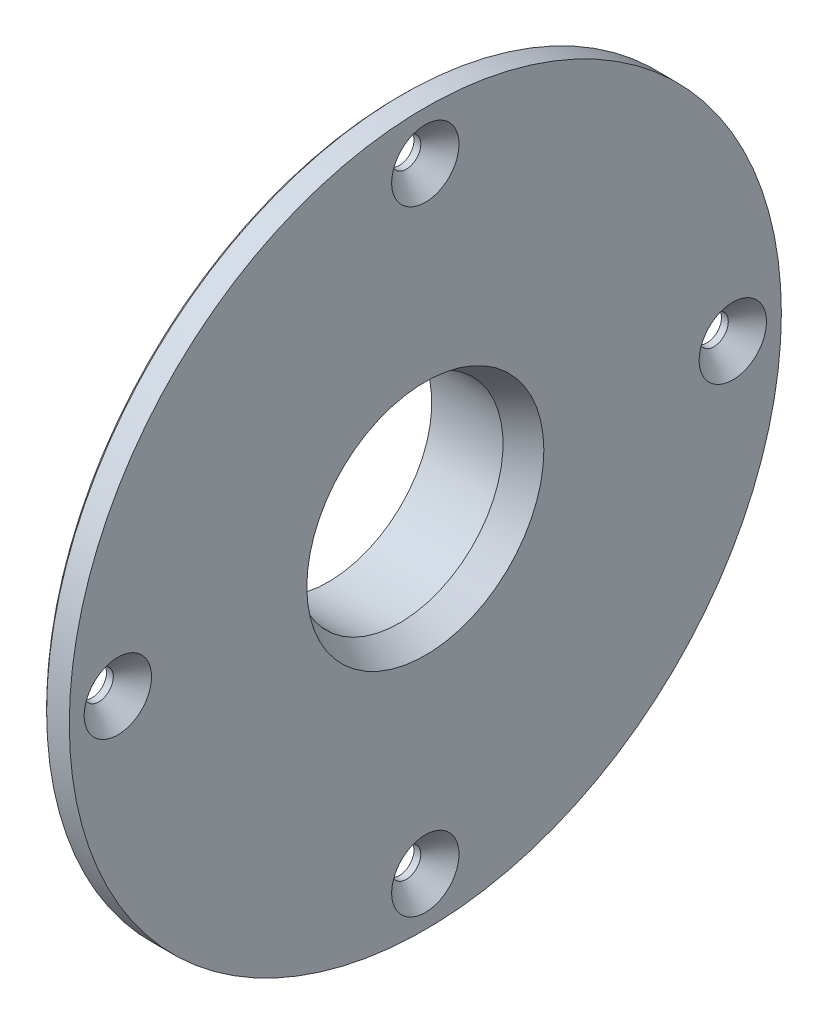
ISO-10303-21;
HEADER;
FILE_DESCRIPTION(('STEP AP214'),'2;1');
FILE_NAME('part.step','',(''),(''),'','','');
FILE_SCHEMA(('AUTOMOTIVE_DESIGN { 1 0 10303 214 1 1 1 1 }'));
ENDSEC;
DATA;
#1=APPLICATION_CONTEXT('core data for automotive mechanical design processes');
#2=APPLICATION_PROTOCOL_DEFINITION('international standard','automotive_design',2000,#1);
#3=PRODUCT_CONTEXT('',#1,'mechanical');
#4=PRODUCT('Part','Part','',(#3));
#5=PRODUCT_RELATED_PRODUCT_CATEGORY('part','',(#4));
#6=PRODUCT_DEFINITION_FORMATION('','',#4);
#7=PRODUCT_DEFINITION_CONTEXT('part definition',#1,'design');
#8=PRODUCT_DEFINITION('design','',#6,#7);
#9=PRODUCT_DEFINITION_SHAPE('','',#8);
#10=(LENGTH_UNIT() NAMED_UNIT(*) SI_UNIT(.MILLI.,.METRE.));
#11=(NAMED_UNIT(*) PLANE_ANGLE_UNIT() SI_UNIT($,.RADIAN.));
#12=(NAMED_UNIT(*) SI_UNIT($,.STERADIAN.) SOLID_ANGLE_UNIT());
#13=UNCERTAINTY_MEASURE_WITH_UNIT(LENGTH_MEASURE(1.E-05),#10,'distance_accuracy_value','');
#14=(GEOMETRIC_REPRESENTATION_CONTEXT(3) GLOBAL_UNCERTAINTY_ASSIGNED_CONTEXT((#13)) GLOBAL_UNIT_ASSIGNED_CONTEXT((#10,
#11,#12)) REPRESENTATION_CONTEXT('',''));
#15=CARTESIAN_POINT('',(0.,0.,0.));
#16=DIRECTION('',(0.,0.,1.));
#17=DIRECTION('',(1.,0.,0.));
#18=AXIS2_PLACEMENT_3D('',#15,#16,#17);
#19=CARTESIAN_POINT('',(0.,0.,0.));
#20=DIRECTION('',(-1.,0.,0.));
#21=DIRECTION('',(0.,0.,1.));
#22=AXIS2_PLACEMENT_3D('',#19,#20,#21);
#23=CYLINDRICAL_SURFACE('',#22,26.5);
#24=CARTESIAN_POINT('',(7.,0.,0.));
#25=DIRECTION('',(-1.,0.,0.));
#26=DIRECTION('',(0.,0.,1.));
#27=AXIS2_PLACEMENT_3D('',#24,#25,#26);
#28=CIRCLE('',#27,26.5);
#29=CARTESIAN_POINT('',(7.,0.,26.5));
#30=VERTEX_POINT('',#29);
#31=EDGE_CURVE('E131',#30,#30,#28,.T.);
#32=ORIENTED_EDGE('',*,*,#31,.F.);
#33=EDGE_LOOP('',(#32));
#34=FACE_BOUND('',#33,.T.);
#35=CARTESIAN_POINT('',(11.,0.,0.));
#36=DIRECTION('',(-1.,0.,0.));
#37=DIRECTION('',(0.,0.,1.));
#38=AXIS2_PLACEMENT_3D('',#35,#36,#37);
#39=CIRCLE('',#38,26.5);
#40=CARTESIAN_POINT('',(11.,0.,26.5));
#41=VERTEX_POINT('',#40);
#42=EDGE_CURVE('E119',#41,#41,#39,.T.);
#43=ORIENTED_EDGE('',*,*,#42,.T.);
#44=EDGE_LOOP('',(#43));
#45=FACE_BOUND('',#44,.T.);
#46=ADVANCED_FACE('F37',(#34,#45),#23,.T.);
#47=CARTESIAN_POINT('',(7.,26.5,0.));
#48=DIRECTION('',(1.,0.,0.));
#49=DIRECTION('',(0.,0.,-1.));
#50=AXIS2_PLACEMENT_3D('',#47,#48,#49);
#51=PLANE('',#50);
#52=CARTESIAN_POINT('',(7.,0.,0.));
#53=DIRECTION('',(-1.,0.,0.));
#54=DIRECTION('',(0.,0.,1.));
#55=AXIS2_PLACEMENT_3D('',#52,#53,#54);
#56=CIRCLE('',#55,25.);
#57=CARTESIAN_POINT('',(7.,0.,25.));
#58=VERTEX_POINT('',#57);
#59=EDGE_CURVE('E128',#58,#58,#56,.T.);
#60=ORIENTED_EDGE('',*,*,#59,.F.);
#61=EDGE_LOOP('',(#60));
#62=FACE_BOUND('',#61,.T.);
#63=ORIENTED_EDGE('',*,*,#31,.T.);
#64=EDGE_LOOP('',(#63));
#65=FACE_BOUND('',#64,.T.);
#66=ADVANCED_FACE('F167',(#62,#65),#51,.F.);
#67=CARTESIAN_POINT('',(0.,0.,0.));
#68=DIRECTION('',(-1.,0.,0.));
#69=DIRECTION('',(0.,0.,1.));
#70=AXIS2_PLACEMENT_3D('',#67,#68,#69);
#71=CYLINDRICAL_SURFACE('',#70,25.);
#72=CARTESIAN_POINT('',(0.499999999999997,0.,0.));
#73=DIRECTION('',(1.,0.,0.));
#74=DIRECTION('',(0.,0.,-1.));
#75=AXIS2_PLACEMENT_3D('',#72,#73,#74);
#76=CIRCLE('',#75,25.);
#77=CARTESIAN_POINT('',(0.499999999999997,0.,-25.));
#78=VERTEX_POINT('',#77);
#79=EDGE_CURVE('E151',#78,#78,#76,.T.);
#80=ORIENTED_EDGE('',*,*,#79,.T.);
#81=EDGE_LOOP('',(#80));
#82=FACE_BOUND('',#81,.T.);
#83=ORIENTED_EDGE('',*,*,#59,.T.);
#84=EDGE_LOOP('',(#83));
#85=FACE_BOUND('',#84,.T.);
#86=ADVANCED_FACE('F173',(#82,#85),#71,.T.);
#87=CARTESIAN_POINT('',(0.,16.,0.));
#88=DIRECTION('',(1.,0.,0.));
#89=DIRECTION('',(0.,0.,-1.));
#90=AXIS2_PLACEMENT_3D('',#87,#88,#89);
#91=PLANE('',#90);
#92=CARTESIAN_POINT('',(0.,22.5,0.));
#93=DIRECTION('',(-1.,0.,0.));
#94=DIRECTION('',(0.,0.,1.));
#95=AXIS2_PLACEMENT_3D('',#92,#93,#94);
#96=CIRCLE('',#95,1.24999999999999);
#97=CARTESIAN_POINT('',(0.,22.5,1.24999999999999));
#98=VERTEX_POINT('',#97);
#99=EDGE_CURVE('E69',#98,#98,#96,.T.);
#100=ORIENTED_EDGE('',*,*,#99,.F.);
#101=EDGE_LOOP('',(#100));
#102=FACE_BOUND('',#101,.T.);
#103=CARTESIAN_POINT('',(0.,0.,-22.5));
#104=DIRECTION('',(-1.,0.,0.));
#105=DIRECTION('',(0.,0.,1.));
#106=AXIS2_PLACEMENT_3D('',#103,#104,#105);
#107=CIRCLE('',#106,1.24999999999999);
#108=CARTESIAN_POINT('',(0.,0.,-21.25));
#109=VERTEX_POINT('',#108);
#110=EDGE_CURVE('E68',#109,#109,#107,.T.);
#111=ORIENTED_EDGE('',*,*,#110,.F.);
#112=EDGE_LOOP('',(#111));
#113=FACE_BOUND('',#112,.T.);
#114=CARTESIAN_POINT('',(0.,-22.5,0.));
#115=DIRECTION('',(-1.,0.,0.));
#116=DIRECTION('',(0.,0.,1.));
#117=AXIS2_PLACEMENT_3D('',#114,#115,#116);
#118=CIRCLE('',#117,1.24999999999999);
#119=CARTESIAN_POINT('',(0.,-22.5,1.24999999999999));
#120=VERTEX_POINT('',#119);
#121=EDGE_CURVE('E79',#120,#120,#118,.T.);
#122=ORIENTED_EDGE('',*,*,#121,.F.);
#123=EDGE_LOOP('',(#122));
#124=FACE_BOUND('',#123,.T.);
#125=CARTESIAN_POINT('',(0.,0.,22.5));
#126=DIRECTION('',(-1.,0.,0.));
#127=DIRECTION('',(0.,0.,1.));
#128=AXIS2_PLACEMENT_3D('',#125,#126,#127);
#129=CIRCLE('',#128,1.24999999999999);
#130=CARTESIAN_POINT('',(0.,0.,23.75));
#131=VERTEX_POINT('',#130);
#132=EDGE_CURVE('E85',#131,#131,#129,.T.);
#133=ORIENTED_EDGE('',*,*,#132,.F.);
#134=EDGE_LOOP('',(#133));
#135=FACE_BOUND('',#134,.T.);
#136=CARTESIAN_POINT('',(0.,0.,0.));
#137=DIRECTION('',(1.,0.,0.));
#138=DIRECTION('',(0.,0.,-1.));
#139=AXIS2_PLACEMENT_3D('',#136,#137,#138);
#140=CIRCLE('',#139,24.5);
#141=CARTESIAN_POINT('',(0.,0.,-24.5));
#142=VERTEX_POINT('',#141);
#143=EDGE_CURVE('E148',#142,#142,#140,.F.);
#144=ORIENTED_EDGE('',*,*,#143,.T.);
#145=EDGE_LOOP('',(#144));
#146=FACE_BOUND('',#145,.T.);
#147=CARTESIAN_POINT('',(0.,0.,0.));
#148=DIRECTION('',(-1.,0.,0.));
#149=DIRECTION('',(0.,0.,1.));
#150=AXIS2_PLACEMENT_3D('',#147,#148,#149);
#151=CIRCLE('',#150,16.);
#152=CARTESIAN_POINT('',(0.,0.,16.));
#153=VERTEX_POINT('',#152);
#154=EDGE_CURVE('E125',#153,#153,#151,.T.);
#155=ORIENTED_EDGE('',*,*,#154,.F.);
#156=EDGE_LOOP('',(#155));
#157=FACE_BOUND('',#156,.T.);
#158=ADVANCED_FACE('F197',(#102,#113,#124,#135,#146,#157),#91,.F.);
#159=CARTESIAN_POINT('',(0.,0.,0.));
#160=DIRECTION('',(-1.,0.,0.));
#161=DIRECTION('',(0.,0.,1.));
#162=AXIS2_PLACEMENT_3D('',#159,#160,#161);
#163=CYLINDRICAL_SURFACE('',#162,16.);
#164=CARTESIAN_POINT('',(11.,0.,0.));
#165=DIRECTION('',(-1.,0.,0.));
#166=DIRECTION('',(0.,0.,1.));
#167=AXIS2_PLACEMENT_3D('',#164,#165,#166);
#168=CIRCLE('',#167,16.);
#169=CARTESIAN_POINT('',(11.,0.,16.));
#170=VERTEX_POINT('',#169);
#171=EDGE_CURVE('E11',#170,#170,#168,.F.);
#172=ORIENTED_EDGE('',*,*,#171,.T.);
#173=EDGE_LOOP('',(#172));
#174=FACE_BOUND('',#173,.T.);
#175=ORIENTED_EDGE('',*,*,#154,.T.);
#176=EDGE_LOOP('',(#175));
#177=FACE_BOUND('',#176,.T.);
#178=ADVANCED_FACE('F200',(#174,#177),#163,.F.);
#179=CARTESIAN_POINT('',(15.,55.,0.));
#180=DIRECTION('',(-1.,0.,0.));
#181=DIRECTION('',(0.,0.,1.));
#182=AXIS2_PLACEMENT_3D('',#179,#180,#181);
#183=PLANE('',#182);
#184=CARTESIAN_POINT('',(15.,0.,0.));
#185=DIRECTION('',(-1.,0.,0.));
#186=DIRECTION('',(0.,0.,1.));
#187=AXIS2_PLACEMENT_3D('',#184,#185,#186);
#188=CIRCLE('',#187,18.3094010767585);
#189=CARTESIAN_POINT('',(15.,0.,18.3094010767585));
#190=VERTEX_POINT('',#189);
#191=EDGE_CURVE('E45',#190,#190,#188,.T.);
#192=ORIENTED_EDGE('',*,*,#191,.T.);
#193=EDGE_LOOP('',(#192));
#194=FACE_BOUND('',#193,.T.);
#195=CARTESIAN_POINT('',(15.,47.5,0.));
#196=DIRECTION('',(1.,0.,0.));
#197=DIRECTION('',(0.,0.,-1.));
#198=AXIS2_PLACEMENT_3D('',#195,#196,#197);
#199=CIRCLE('',#198,5.2);
#200=CARTESIAN_POINT('',(15.,47.5,-5.20000000000001));
#201=VERTEX_POINT('',#200);
#202=EDGE_CURVE('E91',#201,#201,#199,.T.);
#203=ORIENTED_EDGE('',*,*,#202,.F.);
#204=EDGE_LOOP('',(#203));
#205=FACE_BOUND('',#204,.T.);
#206=CARTESIAN_POINT('',(15.,0.,-47.5));
#207=DIRECTION('',(1.,0.,0.));
#208=DIRECTION('',(0.,0.,-1.));
#209=AXIS2_PLACEMENT_3D('',#206,#207,#208);
#210=CIRCLE('',#209,5.2);
#211=CARTESIAN_POINT('',(15.,0.,-52.7));
#212=VERTEX_POINT('',#211);
#213=EDGE_CURVE('E98',#212,#212,#210,.T.);
#214=ORIENTED_EDGE('',*,*,#213,.F.);
#215=EDGE_LOOP('',(#214));
#216=FACE_BOUND('',#215,.T.);
#217=CARTESIAN_POINT('',(15.,-47.5,0.));
#218=DIRECTION('',(1.,0.,0.));
#219=DIRECTION('',(0.,0.,-1.));
#220=AXIS2_PLACEMENT_3D('',#217,#218,#219);
#221=CIRCLE('',#220,5.2);
#222=CARTESIAN_POINT('',(15.,-47.5,-5.20000000000001));
#223=VERTEX_POINT('',#222);
#224=EDGE_CURVE('E105',#223,#223,#221,.T.);
#225=ORIENTED_EDGE('',*,*,#224,.F.);
#226=EDGE_LOOP('',(#225));
#227=FACE_BOUND('',#226,.T.);
#228=CARTESIAN_POINT('',(15.,0.,47.5));
#229=DIRECTION('',(1.,0.,0.));
#230=DIRECTION('',(0.,0.,-1.));
#231=AXIS2_PLACEMENT_3D('',#228,#229,#230);
#232=CIRCLE('',#231,5.2);
#233=CARTESIAN_POINT('',(15.,0.,42.3));
#234=VERTEX_POINT('',#233);
#235=EDGE_CURVE('E112',#234,#234,#232,.T.);
#236=ORIENTED_EDGE('',*,*,#235,.F.);
#237=EDGE_LOOP('',(#236));
#238=FACE_BOUND('',#237,.T.);
#239=CARTESIAN_POINT('',(15.,0.,0.));
#240=DIRECTION('',(-1.,0.,0.));
#241=DIRECTION('',(0.,0.,1.));
#242=AXIS2_PLACEMENT_3D('',#239,#240,#241);
#243=CIRCLE('',#242,55.);
#244=CARTESIAN_POINT('',(15.,0.,55.));
#245=VERTEX_POINT('',#244);
#246=EDGE_CURVE('E122',#245,#245,#243,.T.);
#247=ORIENTED_EDGE('',*,*,#246,.F.);
#248=EDGE_LOOP('',(#247));
#249=FACE_BOUND('',#248,.T.);
#250=ADVANCED_FACE('F156',(#194,#205,#216,#227,#238,#249),#183,.F.);
#251=CARTESIAN_POINT('',(0.,0.,0.));
#252=DIRECTION('',(-1.,0.,0.));
#253=DIRECTION('',(0.,0.,1.));
#254=AXIS2_PLACEMENT_3D('',#251,#252,#253);
#255=CYLINDRICAL_SURFACE('',#254,55.);
#256=CARTESIAN_POINT('',(11.5,0.,0.));
#257=DIRECTION('',(1.,0.,0.));
#258=DIRECTION('',(0.,0.,-1.));
#259=AXIS2_PLACEMENT_3D('',#256,#257,#258);
#260=CIRCLE('',#259,55.);
#261=CARTESIAN_POINT('',(11.5,0.,-55.));
#262=VERTEX_POINT('',#261);
#263=EDGE_CURVE('E145',#262,#262,#260,.T.);
#264=ORIENTED_EDGE('',*,*,#263,.T.);
#265=EDGE_LOOP('',(#264));
#266=FACE_BOUND('',#265,.T.);
#267=ORIENTED_EDGE('',*,*,#246,.T.);
#268=EDGE_LOOP('',(#267));
#269=FACE_BOUND('',#268,.T.);
#270=ADVANCED_FACE('F211',(#266,#269),#255,.T.);
#271=CARTESIAN_POINT('',(11.,26.5,0.));
#272=DIRECTION('',(1.,0.,0.));
#273=DIRECTION('',(0.,0.,-1.));
#274=AXIS2_PLACEMENT_3D('',#271,#272,#273);
#275=PLANE('',#274);
#276=CARTESIAN_POINT('',(11.,0.,0.));
#277=DIRECTION('',(1.,0.,0.));
#278=DIRECTION('',(0.,0.,-1.));
#279=AXIS2_PLACEMENT_3D('',#276,#277,#278);
#280=CIRCLE('',#279,54.5);
#281=CARTESIAN_POINT('',(11.,0.,-54.5));
#282=VERTEX_POINT('',#281);
#283=EDGE_CURVE('E134',#282,#282,#280,.F.);
#284=ORIENTED_EDGE('',*,*,#283,.T.);
#285=EDGE_LOOP('',(#284));
#286=FACE_BOUND('',#285,.T.);
#287=CARTESIAN_POINT('',(11.,47.5,0.));
#288=DIRECTION('',(1.,0.,0.));
#289=DIRECTION('',(0.,0.,-1.));
#290=AXIS2_PLACEMENT_3D('',#287,#288,#289);
#291=CIRCLE('',#290,2.24999999999999);
#292=CARTESIAN_POINT('',(11.,47.5,-2.25));
#293=VERTEX_POINT('',#292);
#294=EDGE_CURVE('E97',#293,#293,#291,.T.);
#295=ORIENTED_EDGE('',*,*,#294,.T.);
#296=EDGE_LOOP('',(#295));
#297=FACE_BOUND('',#296,.T.);
#298=CARTESIAN_POINT('',(11.,0.,-47.5));
#299=DIRECTION('',(1.,0.,0.));
#300=DIRECTION('',(0.,0.,-1.));
#301=AXIS2_PLACEMENT_3D('',#298,#299,#300);
#302=CIRCLE('',#301,2.24999999999999);
#303=CARTESIAN_POINT('',(11.,0.,-49.75));
#304=VERTEX_POINT('',#303);
#305=EDGE_CURVE('E104',#304,#304,#302,.T.);
#306=ORIENTED_EDGE('',*,*,#305,.T.);
#307=EDGE_LOOP('',(#306));
#308=FACE_BOUND('',#307,.T.);
#309=CARTESIAN_POINT('',(11.,-47.5,0.));
#310=DIRECTION('',(1.,0.,0.));
#311=DIRECTION('',(0.,0.,-1.));
#312=AXIS2_PLACEMENT_3D('',#309,#310,#311);
#313=CIRCLE('',#312,2.24999999999999);
#314=CARTESIAN_POINT('',(11.,-47.5,-2.25));
#315=VERTEX_POINT('',#314);
#316=EDGE_CURVE('E111',#315,#315,#313,.T.);
#317=ORIENTED_EDGE('',*,*,#316,.T.);
#318=EDGE_LOOP('',(#317));
#319=FACE_BOUND('',#318,.T.);
#320=CARTESIAN_POINT('',(11.,0.,47.5));
#321=DIRECTION('',(1.,0.,0.));
#322=DIRECTION('',(0.,0.,-1.));
#323=AXIS2_PLACEMENT_3D('',#320,#321,#322);
#324=CIRCLE('',#323,2.24999999999999);
#325=CARTESIAN_POINT('',(11.,0.,45.25));
#326=VERTEX_POINT('',#325);
#327=EDGE_CURVE('E118',#326,#326,#324,.T.);
#328=ORIENTED_EDGE('',*,*,#327,.T.);
#329=EDGE_LOOP('',(#328));
#330=FACE_BOUND('',#329,.T.);
#331=ORIENTED_EDGE('',*,*,#42,.F.);
#332=EDGE_LOOP('',(#331));
#333=FACE_BOUND('',#332,.T.);
#334=ADVANCED_FACE('F327',(#286,#297,#308,#319,#330,#333),#275,.F.);
#335=CARTESIAN_POINT('',(15.,0.,47.5));
#336=DIRECTION('',(1.,0.,0.));
#337=DIRECTION('',(0.,0.,-1.));
#338=AXIS2_PLACEMENT_3D('',#335,#336,#337);
#339=CYLINDRICAL_SURFACE('',#338,2.24999999999999);
#340=CARTESIAN_POINT('',(12.05,0.,47.5));
#341=DIRECTION('',(1.,0.,0.));
#342=DIRECTION('',(0.,0.,-1.));
#343=AXIS2_PLACEMENT_3D('',#340,#341,#342);
#344=CIRCLE('',#343,2.24999999999999);
#345=CARTESIAN_POINT('',(12.05,0.,45.25));
#346=VERTEX_POINT('',#345);
#347=EDGE_CURVE('E115',#346,#346,#344,.T.);
#348=ORIENTED_EDGE('',*,*,#347,.T.);
#349=EDGE_LOOP('',(#348));
#350=FACE_BOUND('',#349,.T.);
#351=ORIENTED_EDGE('',*,*,#327,.F.);
#352=EDGE_LOOP('',(#351));
#353=FACE_BOUND('',#352,.T.);
#354=ADVANCED_FACE('F333',(#350,#353),#339,.F.);
#355=CARTESIAN_POINT('',(15.,0.,47.5));
#356=DIRECTION('',(1.,0.,0.));
#357=DIRECTION('',(0.,0.,-1.));
#358=AXIS2_PLACEMENT_3D('',#355,#356,#357);
#359=CONICAL_SURFACE('',#358,5.2,0.785398163397451);
#360=ORIENTED_EDGE('',*,*,#347,.F.);
#361=EDGE_LOOP('',(#360));
#362=FACE_BOUND('',#361,.T.);
#363=ORIENTED_EDGE('',*,*,#235,.T.);
#364=EDGE_LOOP('',(#363));
#365=FACE_BOUND('',#364,.T.);
#366=ADVANCED_FACE('F341',(#362,#365),#359,.F.);
#367=CARTESIAN_POINT('',(15.,-47.5,0.));
#368=DIRECTION('',(1.,0.,0.));
#369=DIRECTION('',(0.,0.,-1.));
#370=AXIS2_PLACEMENT_3D('',#367,#368,#369);
#371=CYLINDRICAL_SURFACE('',#370,2.24999999999999);
#372=CARTESIAN_POINT('',(12.05,-47.5,0.));
#373=DIRECTION('',(1.,0.,0.));
#374=DIRECTION('',(0.,0.,-1.));
#375=AXIS2_PLACEMENT_3D('',#372,#373,#374);
#376=CIRCLE('',#375,2.24999999999999);
#377=CARTESIAN_POINT('',(12.05,-47.5,-2.25));
#378=VERTEX_POINT('',#377);
#379=EDGE_CURVE('E108',#378,#378,#376,.T.);
#380=ORIENTED_EDGE('',*,*,#379,.T.);
#381=EDGE_LOOP('',(#380));
#382=FACE_BOUND('',#381,.T.);
#383=ORIENTED_EDGE('',*,*,#316,.F.);
#384=EDGE_LOOP('',(#383));
#385=FACE_BOUND('',#384,.T.);
#386=ADVANCED_FACE('F349',(#382,#385),#371,.F.);
#387=CARTESIAN_POINT('',(15.,-47.5,0.));
#388=DIRECTION('',(1.,0.,0.));
#389=DIRECTION('',(0.,0.,-1.));
#390=AXIS2_PLACEMENT_3D('',#387,#388,#389);
#391=CONICAL_SURFACE('',#390,5.2,0.78539816339745);
#392=ORIENTED_EDGE('',*,*,#379,.F.);
#393=EDGE_LOOP('',(#392));
#394=FACE_BOUND('',#393,.T.);
#395=ORIENTED_EDGE('',*,*,#224,.T.);
#396=EDGE_LOOP('',(#395));
#397=FACE_BOUND('',#396,.T.);
#398=ADVANCED_FACE('F357',(#394,#397),#391,.F.);
#399=CARTESIAN_POINT('',(15.,0.,-47.5));
#400=DIRECTION('',(1.,0.,0.));
#401=DIRECTION('',(0.,0.,-1.));
#402=AXIS2_PLACEMENT_3D('',#399,#400,#401);
#403=CYLINDRICAL_SURFACE('',#402,2.24999999999999);
#404=CARTESIAN_POINT('',(12.05,0.,-47.5));
#405=DIRECTION('',(1.,0.,0.));
#406=DIRECTION('',(0.,0.,-1.));
#407=AXIS2_PLACEMENT_3D('',#404,#405,#406);
#408=CIRCLE('',#407,2.24999999999999);
#409=CARTESIAN_POINT('',(12.05,0.,-49.75));
#410=VERTEX_POINT('',#409);
#411=EDGE_CURVE('E101',#410,#410,#408,.T.);
#412=ORIENTED_EDGE('',*,*,#411,.T.);
#413=EDGE_LOOP('',(#412));
#414=FACE_BOUND('',#413,.T.);
#415=ORIENTED_EDGE('',*,*,#305,.F.);
#416=EDGE_LOOP('',(#415));
#417=FACE_BOUND('',#416,.T.);
#418=ADVANCED_FACE('F365',(#414,#417),#403,.F.);
#419=CARTESIAN_POINT('',(15.,0.,-47.5));
#420=DIRECTION('',(1.,0.,0.));
#421=DIRECTION('',(0.,0.,-1.));
#422=AXIS2_PLACEMENT_3D('',#419,#420,#421);
#423=CONICAL_SURFACE('',#422,5.2,0.785398163397451);
#424=ORIENTED_EDGE('',*,*,#411,.F.);
#425=EDGE_LOOP('',(#424));
#426=FACE_BOUND('',#425,.T.);
#427=ORIENTED_EDGE('',*,*,#213,.T.);
#428=EDGE_LOOP('',(#427));
#429=FACE_BOUND('',#428,.T.);
#430=ADVANCED_FACE('F373',(#426,#429),#423,.F.);
#431=CARTESIAN_POINT('',(15.,47.5,0.));
#432=DIRECTION('',(1.,0.,0.));
#433=DIRECTION('',(0.,0.,-1.));
#434=AXIS2_PLACEMENT_3D('',#431,#432,#433);
#435=CYLINDRICAL_SURFACE('',#434,2.24999999999999);
#436=CARTESIAN_POINT('',(12.05,47.5,0.));
#437=DIRECTION('',(1.,0.,0.));
#438=DIRECTION('',(0.,0.,-1.));
#439=AXIS2_PLACEMENT_3D('',#436,#437,#438);
#440=CIRCLE('',#439,2.24999999999999);
#441=CARTESIAN_POINT('',(12.05,47.5,-2.25));
#442=VERTEX_POINT('',#441);
#443=EDGE_CURVE('E94',#442,#442,#440,.T.);
#444=ORIENTED_EDGE('',*,*,#443,.T.);
#445=EDGE_LOOP('',(#444));
#446=FACE_BOUND('',#445,.T.);
#447=ORIENTED_EDGE('',*,*,#294,.F.);
#448=EDGE_LOOP('',(#447));
#449=FACE_BOUND('',#448,.T.);
#450=ADVANCED_FACE('F381',(#446,#449),#435,.F.);
#451=CARTESIAN_POINT('',(15.,47.5,0.));
#452=DIRECTION('',(1.,0.,0.));
#453=DIRECTION('',(0.,0.,-1.));
#454=AXIS2_PLACEMENT_3D('',#451,#452,#453);
#455=CONICAL_SURFACE('',#454,5.2,0.78539816339745);
#456=ORIENTED_EDGE('',*,*,#443,.F.);
#457=EDGE_LOOP('',(#456));
#458=FACE_BOUND('',#457,.T.);
#459=ORIENTED_EDGE('',*,*,#202,.T.);
#460=EDGE_LOOP('',(#459));
#461=FACE_BOUND('',#460,.T.);
#462=ADVANCED_FACE('F183',(#458,#461),#455,.F.);
#463=CARTESIAN_POINT('',(11.,0.,0.));
#464=DIRECTION('',(1.,0.,0.));
#465=DIRECTION('',(0.,0.,-1.));
#466=AXIS2_PLACEMENT_3D('',#463,#464,#465);
#467=CONICAL_SURFACE('',#466,54.5,0.785398163397434);
#468=ORIENTED_EDGE('',*,*,#263,.F.);
#469=EDGE_LOOP('',(#468));
#470=FACE_BOUND('',#469,.T.);
#471=ORIENTED_EDGE('',*,*,#283,.F.);
#472=EDGE_LOOP('',(#471));
#473=FACE_BOUND('',#472,.T.);
#474=ADVANCED_FACE('F180',(#470,#473),#467,.T.);
#475=CARTESIAN_POINT('',(0.,0.,0.));
#476=DIRECTION('',(1.,0.,0.));
#477=DIRECTION('',(0.,0.,-1.));
#478=AXIS2_PLACEMENT_3D('',#475,#476,#477);
#479=CONICAL_SURFACE('',#478,24.5,0.785398163397455);
#480=ORIENTED_EDGE('',*,*,#79,.F.);
#481=EDGE_LOOP('',(#480));
#482=FACE_BOUND('',#481,.T.);
#483=ORIENTED_EDGE('',*,*,#143,.F.);
#484=EDGE_LOOP('',(#483));
#485=FACE_BOUND('',#484,.T.);
#486=ADVANCED_FACE('F182',(#482,#485),#479,.T.);
#487=CARTESIAN_POINT('',(10.5,0.,22.5));
#488=DIRECTION('',(-1.,0.,0.));
#489=DIRECTION('',(0.,0.,1.));
#490=AXIS2_PLACEMENT_3D('',#487,#488,#489);
#491=CONICAL_SURFACE('',#490,1.25,1.02974425867665);
#492=CARTESIAN_POINT('',(11.2510757737845,0.,22.5));
#493=VERTEX_POINT('',#492);
#494=VERTEX_LOOP('',#493);
#495=FACE_BOUND('',#494,.T.);
#496=CARTESIAN_POINT('',(10.5,0.,22.5));
#497=DIRECTION('',(-1.,0.,0.));
#498=DIRECTION('',(0.,0.,1.));
#499=AXIS2_PLACEMENT_3D('',#496,#497,#498);
#500=CIRCLE('',#499,1.25);
#501=CARTESIAN_POINT('',(10.5,0.,23.75));
#502=VERTEX_POINT('',#501);
#503=EDGE_CURVE('E88',#502,#502,#500,.T.);
#504=ORIENTED_EDGE('',*,*,#503,.T.);
#505=EDGE_LOOP('',(#504));
#506=FACE_BOUND('',#505,.T.);
#507=ADVANCED_FACE('F186',(#495,#506),#491,.F.);
#508=CARTESIAN_POINT('',(0.,0.,22.5));
#509=DIRECTION('',(-1.,0.,0.));
#510=DIRECTION('',(0.,0.,1.));
#511=AXIS2_PLACEMENT_3D('',#508,#509,#510);
#512=CYLINDRICAL_SURFACE('',#511,1.24999999999999);
#513=ORIENTED_EDGE('',*,*,#503,.F.);
#514=EDGE_LOOP('',(#513));
#515=FACE_BOUND('',#514,.T.);
#516=ORIENTED_EDGE('',*,*,#132,.T.);
#517=EDGE_LOOP('',(#516));
#518=FACE_BOUND('',#517,.T.);
#519=ADVANCED_FACE('F191',(#515,#518),#512,.F.);
#520=CARTESIAN_POINT('',(10.5,-22.5,0.));
#521=DIRECTION('',(-1.,0.,0.));
#522=DIRECTION('',(0.,0.,1.));
#523=AXIS2_PLACEMENT_3D('',#520,#521,#522);
#524=CONICAL_SURFACE('',#523,1.25,1.02974425867665);
#525=CARTESIAN_POINT('',(11.2510757737845,-22.5,0.));
#526=VERTEX_POINT('',#525);
#527=VERTEX_LOOP('',#526);
#528=FACE_BOUND('',#527,.T.);
#529=CARTESIAN_POINT('',(10.5,-22.5,0.));
#530=DIRECTION('',(-1.,0.,0.));
#531=DIRECTION('',(0.,0.,1.));
#532=AXIS2_PLACEMENT_3D('',#529,#530,#531);
#533=CIRCLE('',#532,1.25);
#534=CARTESIAN_POINT('',(10.5,-22.5,1.25));
#535=VERTEX_POINT('',#534);
#536=EDGE_CURVE('E82',#535,#535,#533,.T.);
#537=ORIENTED_EDGE('',*,*,#536,.T.);
#538=EDGE_LOOP('',(#537));
#539=FACE_BOUND('',#538,.T.);
#540=ADVANCED_FACE('F249',(#528,#539),#524,.F.);
#541=CARTESIAN_POINT('',(0.,-22.5,0.));
#542=DIRECTION('',(-1.,0.,0.));
#543=DIRECTION('',(0.,0.,1.));
#544=AXIS2_PLACEMENT_3D('',#541,#542,#543);
#545=CYLINDRICAL_SURFACE('',#544,1.24999999999999);
#546=ORIENTED_EDGE('',*,*,#536,.F.);
#547=EDGE_LOOP('',(#546));
#548=FACE_BOUND('',#547,.T.);
#549=ORIENTED_EDGE('',*,*,#121,.T.);
#550=EDGE_LOOP('',(#549));
#551=FACE_BOUND('',#550,.T.);
#552=ADVANCED_FACE('F261',(#548,#551),#545,.F.);
#553=CARTESIAN_POINT('',(10.5,0.,-22.5));
#554=DIRECTION('',(-1.,0.,0.));
#555=DIRECTION('',(0.,0.,1.));
#556=AXIS2_PLACEMENT_3D('',#553,#554,#555);
#557=CONICAL_SURFACE('',#556,1.25,1.02974425867665);
#558=CARTESIAN_POINT('',(11.2510757737845,0.,-22.5));
#559=VERTEX_POINT('',#558);
#560=VERTEX_LOOP('',#559);
#561=FACE_BOUND('',#560,.T.);
#562=CARTESIAN_POINT('',(10.5,0.,-22.5));
#563=DIRECTION('',(-1.,0.,0.));
#564=DIRECTION('',(0.,0.,1.));
#565=AXIS2_PLACEMENT_3D('',#562,#563,#564);
#566=CIRCLE('',#565,1.25);
#567=CARTESIAN_POINT('',(10.5,0.,-21.25));
#568=VERTEX_POINT('',#567);
#569=EDGE_CURVE('E72',#568,#568,#566,.T.);
#570=ORIENTED_EDGE('',*,*,#569,.T.);
#571=EDGE_LOOP('',(#570));
#572=FACE_BOUND('',#571,.T.);
#573=ADVANCED_FACE('F270',(#561,#572),#557,.F.);
#574=CARTESIAN_POINT('',(0.,0.,-22.5));
#575=DIRECTION('',(-1.,0.,0.));
#576=DIRECTION('',(0.,0.,1.));
#577=AXIS2_PLACEMENT_3D('',#574,#575,#576);
#578=CYLINDRICAL_SURFACE('',#577,1.24999999999999);
#579=ORIENTED_EDGE('',*,*,#569,.F.);
#580=EDGE_LOOP('',(#579));
#581=FACE_BOUND('',#580,.T.);
#582=ORIENTED_EDGE('',*,*,#110,.T.);
#583=EDGE_LOOP('',(#582));
#584=FACE_BOUND('',#583,.T.);
#585=ADVANCED_FACE('F62',(#581,#584),#578,.F.);
#586=CARTESIAN_POINT('',(10.5,22.5,0.));
#587=DIRECTION('',(-1.,0.,0.));
#588=DIRECTION('',(0.,0.,1.));
#589=AXIS2_PLACEMENT_3D('',#586,#587,#588);
#590=CONICAL_SURFACE('',#589,1.25,1.02974425867665);
#591=CARTESIAN_POINT('',(11.2510757737845,22.5,0.));
#592=VERTEX_POINT('',#591);
#593=VERTEX_LOOP('',#592);
#594=FACE_BOUND('',#593,.T.);
#595=CARTESIAN_POINT('',(10.5,22.5,0.));
#596=DIRECTION('',(-1.,0.,0.));
#597=DIRECTION('',(0.,0.,1.));
#598=AXIS2_PLACEMENT_3D('',#595,#596,#597);
#599=CIRCLE('',#598,1.25);
#600=CARTESIAN_POINT('',(10.5,22.5,1.25));
#601=VERTEX_POINT('',#600);
#602=EDGE_CURVE('E66',#601,#601,#599,.T.);
#603=ORIENTED_EDGE('',*,*,#602,.T.);
#604=EDGE_LOOP('',(#603));
#605=FACE_BOUND('',#604,.T.);
#606=ADVANCED_FACE('F58',(#594,#605),#590,.F.);
#607=CARTESIAN_POINT('',(0.,22.5,0.));
#608=DIRECTION('',(-1.,0.,0.));
#609=DIRECTION('',(0.,0.,1.));
#610=AXIS2_PLACEMENT_3D('',#607,#608,#609);
#611=CYLINDRICAL_SURFACE('',#610,1.24999999999999);
#612=ORIENTED_EDGE('',*,*,#602,.F.);
#613=EDGE_LOOP('',(#612));
#614=FACE_BOUND('',#613,.T.);
#615=ORIENTED_EDGE('',*,*,#99,.T.);
#616=EDGE_LOOP('',(#615));
#617=FACE_BOUND('',#616,.T.);
#618=ADVANCED_FACE('F61',(#614,#617),#611,.F.);
#619=CARTESIAN_POINT('',(15.,0.,0.));
#620=DIRECTION('',(1.,0.,0.));
#621=DIRECTION('',(0.,0.,-1.));
#622=AXIS2_PLACEMENT_3D('',#619,#620,#621);
#623=CONICAL_SURFACE('',#622,18.3094010767585,0.523598775598296);
#624=ORIENTED_EDGE('',*,*,#171,.F.);
#625=EDGE_LOOP('',(#624));
#626=FACE_BOUND('',#625,.T.);
#627=ORIENTED_EDGE('',*,*,#191,.F.);
#628=EDGE_LOOP('',(#627));
#629=FACE_BOUND('',#628,.T.);
#630=ADVANCED_FACE('F39',(#626,#629),#623,.F.);
#631=CLOSED_SHELL('',(#46,#66,#86,#158,#178,#250,#270,#334,#354,#366,#386,#398,#418,#430,#450,
#462,#474,#486,#507,#519,#540,#552,#573,#585,#606,#618,#630));
#632=MANIFOLD_SOLID_BREP('B2',#631);
#633=ADVANCED_BREP_SHAPE_REPRESENTATION('',(#18,#632),#14);
#634=SHAPE_DEFINITION_REPRESENTATION(#9,#633);
ENDSEC;
END-ISO-10303-21;
